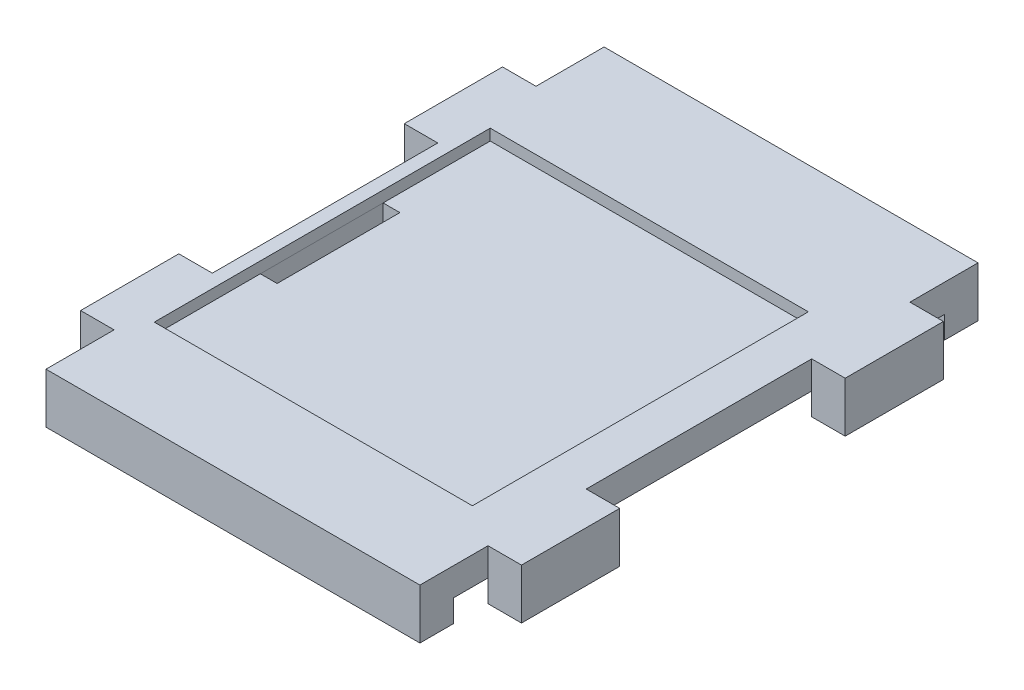
ISO-10303-21;
HEADER;
FILE_DESCRIPTION(('STEP AP214'),'2;1');
FILE_NAME('part.step','',(''),(''),'','','');
FILE_SCHEMA(('AUTOMOTIVE_DESIGN { 1 0 10303 214 1 1 1 1 }'));
ENDSEC;
DATA;
#1=APPLICATION_CONTEXT('core data for automotive mechanical design processes');
#2=APPLICATION_PROTOCOL_DEFINITION('international standard','automotive_design',2000,#1);
#3=PRODUCT_CONTEXT('',#1,'mechanical');
#4=PRODUCT('Part','Part','',(#3));
#5=PRODUCT_RELATED_PRODUCT_CATEGORY('part','',(#4));
#6=PRODUCT_DEFINITION_FORMATION('','',#4);
#7=PRODUCT_DEFINITION_CONTEXT('part definition',#1,'design');
#8=PRODUCT_DEFINITION('design','',#6,#7);
#9=PRODUCT_DEFINITION_SHAPE('','',#8);
#10=(LENGTH_UNIT() NAMED_UNIT(*) SI_UNIT(.MILLI.,.METRE.));
#11=(NAMED_UNIT(*) PLANE_ANGLE_UNIT() SI_UNIT($,.RADIAN.));
#12=(NAMED_UNIT(*) SI_UNIT($,.STERADIAN.) SOLID_ANGLE_UNIT());
#13=UNCERTAINTY_MEASURE_WITH_UNIT(LENGTH_MEASURE(1.E-05),#10,'distance_accuracy_value','');
#14=(GEOMETRIC_REPRESENTATION_CONTEXT(3) GLOBAL_UNCERTAINTY_ASSIGNED_CONTEXT((#13)) GLOBAL_UNIT_ASSIGNED_CONTEXT((#10,
#11,#12)) REPRESENTATION_CONTEXT('',''));
#15=CARTESIAN_POINT('',(0.,0.,0.));
#16=DIRECTION('',(0.,0.,1.));
#17=DIRECTION('',(1.,0.,0.));
#18=AXIS2_PLACEMENT_3D('',#15,#16,#17);
#19=CARTESIAN_POINT('',(0.,0.,0.));
#20=DIRECTION('',(0.,-1.,0.));
#21=DIRECTION('',(0.,0.,-1.));
#22=AXIS2_PLACEMENT_3D('',#19,#20,#21);
#23=PLANE('',#22);
#24=DIRECTION('',(0.,0.,-1.));
#25=VECTOR('',#24,1.);
#26=CARTESIAN_POINT('',(36.5,0.,-50.));
#27=LINE('',#26,#25);
#28=CARTESIAN_POINT('',(36.5,0.,-47.));
#29=VERTEX_POINT('',#28);
#30=CARTESIAN_POINT('',(36.5,0.,-50.));
#31=VERTEX_POINT('',#30);
#32=EDGE_CURVE('E290',#29,#31,#27,.T.);
#33=ORIENTED_EDGE('',*,*,#32,.F.);
#34=DIRECTION('',(-1.,0.,0.));
#35=VECTOR('',#34,1.);
#36=CARTESIAN_POINT('',(3.,0.,-47.));
#37=LINE('',#36,#35);
#38=CARTESIAN_POINT('',(3.,0.,-47.));
#39=VERTEX_POINT('',#38);
#40=EDGE_CURVE('E497',#29,#39,#37,.T.);
#41=ORIENTED_EDGE('',*,*,#40,.T.);
#42=DIRECTION('',(0.,0.,1.));
#43=VECTOR('',#42,1.);
#44=CARTESIAN_POINT('',(3.,0.,-50.));
#45=LINE('',#44,#43);
#46=CARTESIAN_POINT('',(3.,0.,-50.));
#47=VERTEX_POINT('',#46);
#48=EDGE_CURVE('E532',#47,#39,#45,.T.);
#49=ORIENTED_EDGE('',*,*,#48,.F.);
#50=DIRECTION('',(-1.,0.,0.));
#51=VECTOR('',#50,1.);
#52=CARTESIAN_POINT('',(0.,0.,-50.));
#53=LINE('',#52,#51);
#54=EDGE_CURVE('E47',#31,#47,#53,.T.);
#55=ORIENTED_EDGE('',*,*,#54,.F.);
#56=EDGE_LOOP('',(#33,#41,#49,#55));
#57=FACE_BOUND('',#56,.T.);
#58=ADVANCED_FACE('F38',(#57),#23,.T.);
#59=DIRECTION('',(-1.,0.,0.));
#60=VECTOR('',#59,1.);
#61=CARTESIAN_POINT('',(39.5,0.,-43.9));
#62=LINE('',#61,#60);
#63=CARTESIAN_POINT('',(39.5,0.,-43.9));
#64=VERTEX_POINT('',#63);
#65=CARTESIAN_POINT('',(36.5,0.,-43.9));
#66=VERTEX_POINT('',#65);
#67=EDGE_CURVE('E693',#64,#66,#62,.T.);
#68=ORIENTED_EDGE('',*,*,#67,.F.);
#69=DIRECTION('',(0.,0.,-1.));
#70=VECTOR('',#69,1.);
#71=CARTESIAN_POINT('',(39.5,0.,0.));
#72=LINE('',#71,#70);
#73=CARTESIAN_POINT('',(39.5,0.,-35.1));
#74=VERTEX_POINT('',#73);
#75=EDGE_CURVE('E299',#74,#64,#72,.T.);
#76=ORIENTED_EDGE('',*,*,#75,.F.);
#77=DIRECTION('',(1.,0.,0.));
#78=VECTOR('',#77,1.);
#79=CARTESIAN_POINT('',(39.5,0.,-35.1));
#80=LINE('',#79,#78);
#81=CARTESIAN_POINT('',(36.5,0.,-35.1));
#82=VERTEX_POINT('',#81);
#83=EDGE_CURVE('E678',#82,#74,#80,.T.);
#84=ORIENTED_EDGE('',*,*,#83,.F.);
#85=DIRECTION('',(0.,0.,-1.));
#86=VECTOR('',#85,1.);
#87=CARTESIAN_POINT('',(36.5,0.,-3.));
#88=LINE('',#87,#86);
#89=EDGE_CURVE('E493',#82,#66,#88,.T.);
#90=ORIENTED_EDGE('',*,*,#89,.T.);
#91=EDGE_LOOP('',(#68,#76,#84,#90));
#92=FACE_BOUND('',#91,.T.);
#93=ADVANCED_FACE('F705',(#92),#23,.T.);
#94=CARTESIAN_POINT('',(39.5,2.,0.));
#95=DIRECTION('',(-1.,0.,0.));
#96=DIRECTION('',(0.,0.,1.));
#97=AXIS2_PLACEMENT_3D('',#94,#95,#96);
#98=PLANE('',#97);
#99=ORIENTED_EDGE('',*,*,#75,.T.);
#100=DIRECTION('',(0.,-1.,0.));
#101=VECTOR('',#100,1.);
#102=CARTESIAN_POINT('',(39.5,4.5,-43.9));
#103=LINE('',#102,#101);
#104=CARTESIAN_POINT('',(39.5,4.5,-43.9));
#105=VERTEX_POINT('',#104);
#106=EDGE_CURVE('E285',#105,#64,#103,.T.);
#107=ORIENTED_EDGE('',*,*,#106,.F.);
#108=DIRECTION('',(0.,0.,-1.));
#109=VECTOR('',#108,1.);
#110=CARTESIAN_POINT('',(39.5,4.5,-50.));
#111=LINE('',#110,#109);
#112=CARTESIAN_POINT('',(39.5,4.5,-35.1));
#113=VERTEX_POINT('',#112);
#114=EDGE_CURVE('E297',#113,#105,#111,.T.);
#115=ORIENTED_EDGE('',*,*,#114,.F.);
#116=DIRECTION('',(0.,-1.,0.));
#117=VECTOR('',#116,1.);
#118=CARTESIAN_POINT('',(39.5,4.5,-35.1));
#119=LINE('',#118,#117);
#120=EDGE_CURVE('E665',#113,#74,#119,.T.);
#121=ORIENTED_EDGE('',*,*,#120,.T.);
#122=EDGE_LOOP('',(#99,#107,#115,#121));
#123=FACE_BOUND('',#122,.T.);
#124=ADVANCED_FACE('F295',(#123),#98,.F.);
#125=CARTESIAN_POINT('',(36.5,2.,-3.));
#126=DIRECTION('',(-1.,0.,0.));
#127=DIRECTION('',(0.,0.,1.));
#128=AXIS2_PLACEMENT_3D('',#125,#126,#127);
#129=PLANE('',#128);
#130=DIRECTION('',(0.,-1.,0.));
#131=VECTOR('',#130,1.);
#132=CARTESIAN_POINT('',(36.5,4.5,-43.9));
#133=LINE('',#132,#131);
#134=CARTESIAN_POINT('',(36.5,2.,-43.9));
#135=VERTEX_POINT('',#134);
#136=EDGE_CURVE('E300',#135,#66,#133,.T.);
#137=ORIENTED_EDGE('',*,*,#136,.T.);
#138=ORIENTED_EDGE('',*,*,#89,.F.);
#139=DIRECTION('',(0.,-1.,0.));
#140=VECTOR('',#139,1.);
#141=CARTESIAN_POINT('',(36.5,4.5,-35.1));
#142=LINE('',#141,#140);
#143=CARTESIAN_POINT('',(36.5,2.,-35.1));
#144=VERTEX_POINT('',#143);
#145=EDGE_CURVE('E671',#144,#82,#142,.T.);
#146=ORIENTED_EDGE('',*,*,#145,.F.);
#147=DIRECTION('',(0.,0.,-1.));
#148=VECTOR('',#147,1.);
#149=CARTESIAN_POINT('',(36.5,2.,-3.));
#150=LINE('',#149,#148);
#151=EDGE_CURVE('E479',#144,#135,#150,.T.);
#152=ORIENTED_EDGE('',*,*,#151,.T.);
#153=EDGE_LOOP('',(#137,#138,#146,#152));
#154=FACE_BOUND('',#153,.T.);
#155=ADVANCED_FACE('F701',(#154),#129,.T.);
#156=DIRECTION('',(-1.,0.,0.));
#157=VECTOR('',#156,1.);
#158=CARTESIAN_POINT('',(39.5,0.,-14.9));
#159=LINE('',#158,#157);
#160=CARTESIAN_POINT('',(39.5,0.,-14.9));
#161=VERTEX_POINT('',#160);
#162=CARTESIAN_POINT('',(36.5,0.,-14.9));
#163=VERTEX_POINT('',#162);
#164=EDGE_CURVE('E682',#161,#163,#159,.T.);
#165=ORIENTED_EDGE('',*,*,#164,.F.);
#166=CARTESIAN_POINT('',(39.5,0.,-6.1));
#167=VERTEX_POINT('',#166);
#168=EDGE_CURVE('E515',#167,#161,#72,.T.);
#169=ORIENTED_EDGE('',*,*,#168,.F.);
#170=DIRECTION('',(1.,0.,0.));
#171=VECTOR('',#170,1.);
#172=CARTESIAN_POINT('',(39.5,0.,-6.1));
#173=LINE('',#172,#171);
#174=CARTESIAN_POINT('',(36.5,0.,-6.1));
#175=VERTEX_POINT('',#174);
#176=EDGE_CURVE('E650',#175,#167,#173,.T.);
#177=ORIENTED_EDGE('',*,*,#176,.F.);
#178=EDGE_CURVE('E494',#175,#163,#88,.T.);
#179=ORIENTED_EDGE('',*,*,#178,.T.);
#180=EDGE_LOOP('',(#165,#169,#177,#179));
#181=FACE_BOUND('',#180,.T.);
#182=ADVANCED_FACE('F749',(#181),#23,.T.);
#183=DIRECTION('',(-1.,0.,0.));
#184=VECTOR('',#183,1.);
#185=CARTESIAN_POINT('',(0.,0.,-43.9));
#186=LINE('',#185,#184);
#187=CARTESIAN_POINT('',(3.,0.,-43.9));
#188=VERTEX_POINT('',#187);
#189=CARTESIAN_POINT('',(0.,0.,-43.9));
#190=VERTEX_POINT('',#189);
#191=EDGE_CURVE('E541',#188,#190,#186,.T.);
#192=ORIENTED_EDGE('',*,*,#191,.F.);
#193=DIRECTION('',(0.,0.,1.));
#194=VECTOR('',#193,1.);
#195=CARTESIAN_POINT('',(3.,0.,-3.));
#196=LINE('',#195,#194);
#197=CARTESIAN_POINT('',(3.,0.,-35.1));
#198=VERTEX_POINT('',#197);
#199=EDGE_CURVE('E488',#188,#198,#196,.T.);
#200=ORIENTED_EDGE('',*,*,#199,.T.);
#201=DIRECTION('',(1.,0.,0.));
#202=VECTOR('',#201,1.);
#203=CARTESIAN_POINT('',(0.,0.,-35.1));
#204=LINE('',#203,#202);
#205=CARTESIAN_POINT('',(0.,0.,-35.1));
#206=VERTEX_POINT('',#205);
#207=EDGE_CURVE('E555',#206,#198,#204,.T.);
#208=ORIENTED_EDGE('',*,*,#207,.F.);
#209=DIRECTION('',(0.,0.,1.));
#210=VECTOR('',#209,1.);
#211=CARTESIAN_POINT('',(0.,0.,0.));
#212=LINE('',#211,#210);
#213=EDGE_CURVE('E510',#190,#206,#212,.T.);
#214=ORIENTED_EDGE('',*,*,#213,.F.);
#215=EDGE_LOOP('',(#192,#200,#208,#214));
#216=FACE_BOUND('',#215,.T.);
#217=ADVANCED_FACE('F638',(#216),#23,.T.);
#218=DIRECTION('',(-1.,0.,0.));
#219=VECTOR('',#218,1.);
#220=CARTESIAN_POINT('',(0.,0.,-14.9));
#221=LINE('',#220,#219);
#222=CARTESIAN_POINT('',(3.,0.,-14.9));
#223=VERTEX_POINT('',#222);
#224=CARTESIAN_POINT('',(0.,0.,-14.9));
#225=VERTEX_POINT('',#224);
#226=EDGE_CURVE('E562',#223,#225,#221,.T.);
#227=ORIENTED_EDGE('',*,*,#226,.F.);
#228=CARTESIAN_POINT('',(3.,0.,-6.1));
#229=VERTEX_POINT('',#228);
#230=EDGE_CURVE('E470',#223,#229,#196,.T.);
#231=ORIENTED_EDGE('',*,*,#230,.T.);
#232=DIRECTION('',(1.,0.,0.));
#233=VECTOR('',#232,1.);
#234=CARTESIAN_POINT('',(0.,0.,-6.1));
#235=LINE('',#234,#233);
#236=CARTESIAN_POINT('',(0.,0.,-6.1));
#237=VERTEX_POINT('',#236);
#238=EDGE_CURVE('E586',#237,#229,#235,.T.);
#239=ORIENTED_EDGE('',*,*,#238,.F.);
#240=EDGE_CURVE('E509',#225,#237,#212,.T.);
#241=ORIENTED_EDGE('',*,*,#240,.F.);
#242=EDGE_LOOP('',(#227,#231,#239,#241));
#243=FACE_BOUND('',#242,.T.);
#244=ADVANCED_FACE('F610',(#243),#23,.T.);
#245=CARTESIAN_POINT('',(0.,2.,0.));
#246=DIRECTION('',(1.,0.,0.));
#247=DIRECTION('',(0.,0.,-1.));
#248=AXIS2_PLACEMENT_3D('',#245,#246,#247);
#249=PLANE('',#248);
#250=DIRECTION('',(0.,0.,1.));
#251=VECTOR('',#250,1.);
#252=CARTESIAN_POINT('',(0.,4.5,-50.));
#253=LINE('',#252,#251);
#254=CARTESIAN_POINT('',(0.,4.5,-14.9));
#255=VERTEX_POINT('',#254);
#256=CARTESIAN_POINT('',(0.,4.5,-6.1));
#257=VERTEX_POINT('',#256);
#258=EDGE_CURVE('E445',#255,#257,#253,.T.);
#259=ORIENTED_EDGE('',*,*,#258,.F.);
#260=DIRECTION('',(0.,-1.,0.));
#261=VECTOR('',#260,1.);
#262=CARTESIAN_POINT('',(0.,4.5,-14.9));
#263=LINE('',#262,#261);
#264=EDGE_CURVE('E571',#255,#225,#263,.T.);
#265=ORIENTED_EDGE('',*,*,#264,.T.);
#266=ORIENTED_EDGE('',*,*,#240,.T.);
#267=DIRECTION('',(0.,-1.,0.));
#268=VECTOR('',#267,1.);
#269=CARTESIAN_POINT('',(0.,4.5,-6.1));
#270=LINE('',#269,#268);
#271=EDGE_CURVE('E423',#257,#237,#270,.T.);
#272=ORIENTED_EDGE('',*,*,#271,.F.);
#273=EDGE_LOOP('',(#259,#265,#266,#272));
#274=FACE_BOUND('',#273,.T.);
#275=ADVANCED_FACE('F759',(#274),#249,.F.);
#276=CARTESIAN_POINT('',(3.,2.,-3.));
#277=DIRECTION('',(1.,0.,0.));
#278=DIRECTION('',(0.,0.,-1.));
#279=AXIS2_PLACEMENT_3D('',#276,#277,#278);
#280=PLANE('',#279);
#281=DIRECTION('',(0.,-1.,0.));
#282=VECTOR('',#281,1.);
#283=CARTESIAN_POINT('',(3.,4.5,-14.9));
#284=LINE('',#283,#282);
#285=CARTESIAN_POINT('',(3.,2.,-14.9));
#286=VERTEX_POINT('',#285);
#287=EDGE_CURVE('E578',#286,#223,#284,.T.);
#288=ORIENTED_EDGE('',*,*,#287,.F.);
#289=DIRECTION('',(0.,0.,1.));
#290=VECTOR('',#289,1.);
#291=CARTESIAN_POINT('',(3.,2.,-3.));
#292=LINE('',#291,#290);
#293=CARTESIAN_POINT('',(3.,2.,-6.1));
#294=VERTEX_POINT('',#293);
#295=EDGE_CURVE('E475',#286,#294,#292,.T.);
#296=ORIENTED_EDGE('',*,*,#295,.T.);
#297=DIRECTION('',(0.,-1.,0.));
#298=VECTOR('',#297,1.);
#299=CARTESIAN_POINT('',(3.,4.5,-6.1));
#300=LINE('',#299,#298);
#301=EDGE_CURVE('E595',#294,#229,#300,.T.);
#302=ORIENTED_EDGE('',*,*,#301,.T.);
#303=ORIENTED_EDGE('',*,*,#230,.F.);
#304=EDGE_LOOP('',(#288,#296,#302,#303));
#305=FACE_BOUND('',#304,.T.);
#306=ADVANCED_FACE('F612',(#305),#280,.T.);
#307=DIRECTION('',(0.,0.,-1.));
#308=VECTOR('',#307,1.);
#309=CARTESIAN_POINT('',(36.5,0.,0.));
#310=LINE('',#309,#308);
#311=CARTESIAN_POINT('',(36.5,0.,0.));
#312=VERTEX_POINT('',#311);
#313=CARTESIAN_POINT('',(36.5,0.,-3.));
#314=VERTEX_POINT('',#313);
#315=EDGE_CURVE('E654',#312,#314,#310,.T.);
#316=ORIENTED_EDGE('',*,*,#315,.F.);
#317=DIRECTION('',(1.,0.,0.));
#318=VECTOR('',#317,1.);
#319=CARTESIAN_POINT('',(0.,0.,0.));
#320=LINE('',#319,#318);
#321=CARTESIAN_POINT('',(3.,0.,0.));
#322=VERTEX_POINT('',#321);
#323=EDGE_CURVE('E512',#322,#312,#320,.T.);
#324=ORIENTED_EDGE('',*,*,#323,.F.);
#325=DIRECTION('',(0.,0.,1.));
#326=VECTOR('',#325,1.);
#327=CARTESIAN_POINT('',(3.,0.,0.));
#328=LINE('',#327,#326);
#329=CARTESIAN_POINT('',(3.,0.,-3.));
#330=VERTEX_POINT('',#329);
#331=EDGE_CURVE('E590',#330,#322,#328,.T.);
#332=ORIENTED_EDGE('',*,*,#331,.F.);
#333=DIRECTION('',(1.,0.,0.));
#334=VECTOR('',#333,1.);
#335=CARTESIAN_POINT('',(3.,0.,-3.));
#336=LINE('',#335,#334);
#337=EDGE_CURVE('E490',#330,#314,#336,.T.);
#338=ORIENTED_EDGE('',*,*,#337,.T.);
#339=EDGE_LOOP('',(#316,#324,#332,#338));
#340=FACE_BOUND('',#339,.T.);
#341=ADVANCED_FACE('F745',(#340),#23,.T.);
#342=CARTESIAN_POINT('',(0.,4.5,-43.9));
#343=VERTEX_POINT('',#342);
#344=CARTESIAN_POINT('',(0.,4.5,-35.1));
#345=VERTEX_POINT('',#344);
#346=EDGE_CURVE('E315',#343,#345,#253,.T.);
#347=ORIENTED_EDGE('',*,*,#346,.F.);
#348=DIRECTION('',(0.,-1.,0.));
#349=VECTOR('',#348,1.);
#350=CARTESIAN_POINT('',(0.,4.5,-43.9));
#351=LINE('',#350,#349);
#352=EDGE_CURVE('E552',#343,#190,#351,.T.);
#353=ORIENTED_EDGE('',*,*,#352,.T.);
#354=ORIENTED_EDGE('',*,*,#213,.T.);
#355=DIRECTION('',(0.,-1.,0.));
#356=VECTOR('',#355,1.);
#357=CARTESIAN_POINT('',(0.,4.5,-35.1));
#358=LINE('',#357,#356);
#359=EDGE_CURVE('E567',#345,#206,#358,.T.);
#360=ORIENTED_EDGE('',*,*,#359,.F.);
#361=EDGE_LOOP('',(#347,#353,#354,#360));
#362=FACE_BOUND('',#361,.T.);
#363=ADVANCED_FACE('F40',(#362),#249,.F.);
#364=CARTESIAN_POINT('',(0.,2.,0.));
#365=DIRECTION('',(0.,0.,-1.));
#366=DIRECTION('',(-1.,0.,0.));
#367=AXIS2_PLACEMENT_3D('',#364,#365,#366);
#368=PLANE('',#367);
#369=ORIENTED_EDGE('',*,*,#323,.T.);
#370=DIRECTION('',(0.,-1.,0.));
#371=VECTOR('',#370,1.);
#372=CARTESIAN_POINT('',(36.5,4.5,0.));
#373=LINE('',#372,#371);
#374=CARTESIAN_POINT('',(36.5,4.5,0.));
#375=VERTEX_POINT('',#374);
#376=EDGE_CURVE('E643',#375,#312,#373,.T.);
#377=ORIENTED_EDGE('',*,*,#376,.F.);
#378=DIRECTION('',(1.,0.,0.));
#379=VECTOR('',#378,1.);
#380=CARTESIAN_POINT('',(0.,4.5,0.));
#381=LINE('',#380,#379);
#382=CARTESIAN_POINT('',(3.,4.5,0.));
#383=VERTEX_POINT('',#382);
#384=EDGE_CURVE('E308',#383,#375,#381,.T.);
#385=ORIENTED_EDGE('',*,*,#384,.F.);
#386=DIRECTION('',(0.,-1.,0.));
#387=VECTOR('',#386,1.);
#388=CARTESIAN_POINT('',(3.,4.5,0.));
#389=LINE('',#388,#387);
#390=EDGE_CURVE('E412',#383,#322,#389,.T.);
#391=ORIENTED_EDGE('',*,*,#390,.T.);
#392=EDGE_LOOP('',(#369,#377,#385,#391));
#393=FACE_BOUND('',#392,.T.);
#394=ADVANCED_FACE('F758',(#393),#368,.F.);
#395=ORIENTED_EDGE('',*,*,#168,.T.);
#396=DIRECTION('',(0.,-1.,0.));
#397=VECTOR('',#396,1.);
#398=CARTESIAN_POINT('',(39.5,4.5,-14.9));
#399=LINE('',#398,#397);
#400=CARTESIAN_POINT('',(39.5,4.5,-14.9));
#401=VERTEX_POINT('',#400);
#402=EDGE_CURVE('E666',#401,#161,#399,.T.);
#403=ORIENTED_EDGE('',*,*,#402,.F.);
#404=CARTESIAN_POINT('',(39.5,4.5,-6.1));
#405=VERTEX_POINT('',#404);
#406=EDGE_CURVE('E307',#405,#401,#111,.T.);
#407=ORIENTED_EDGE('',*,*,#406,.F.);
#408=DIRECTION('',(0.,-1.,0.));
#409=VECTOR('',#408,1.);
#410=CARTESIAN_POINT('',(39.5,4.5,-6.1));
#411=LINE('',#410,#409);
#412=EDGE_CURVE('E542',#405,#167,#411,.T.);
#413=ORIENTED_EDGE('',*,*,#412,.T.);
#414=EDGE_LOOP('',(#395,#403,#407,#413));
#415=FACE_BOUND('',#414,.T.);
#416=ADVANCED_FACE('F782',(#415),#98,.F.);
#417=CARTESIAN_POINT('',(0.,2.,-50.));
#418=DIRECTION('',(0.,0.,1.));
#419=DIRECTION('',(1.,0.,0.));
#420=AXIS2_PLACEMENT_3D('',#417,#418,#419);
#421=PLANE('',#420);
#422=DIRECTION('',(-1.,0.,0.));
#423=VECTOR('',#422,1.);
#424=CARTESIAN_POINT('',(0.,4.5,-50.));
#425=LINE('',#424,#423);
#426=CARTESIAN_POINT('',(36.5,4.5,-50.));
#427=VERTEX_POINT('',#426);
#428=CARTESIAN_POINT('',(3.,4.5,-50.));
#429=VERTEX_POINT('',#428);
#430=EDGE_CURVE('E312',#427,#429,#425,.T.);
#431=ORIENTED_EDGE('',*,*,#430,.F.);
#432=DIRECTION('',(0.,-1.,0.));
#433=VECTOR('',#432,1.);
#434=CARTESIAN_POINT('',(36.5,4.5,-50.));
#435=LINE('',#434,#433);
#436=EDGE_CURVE('E525',#427,#31,#435,.T.);
#437=ORIENTED_EDGE('',*,*,#436,.T.);
#438=ORIENTED_EDGE('',*,*,#54,.T.);
#439=DIRECTION('',(0.,-1.,0.));
#440=VECTOR('',#439,1.);
#441=CARTESIAN_POINT('',(3.,4.5,-50.));
#442=LINE('',#441,#440);
#443=EDGE_CURVE('E524',#429,#47,#442,.T.);
#444=ORIENTED_EDGE('',*,*,#443,.F.);
#445=EDGE_LOOP('',(#431,#437,#438,#444));
#446=FACE_BOUND('',#445,.T.);
#447=ADVANCED_FACE('F523',(#446),#421,.F.);
#448=DIRECTION('',(0.,-1.,0.));
#449=VECTOR('',#448,1.);
#450=CARTESIAN_POINT('',(3.,4.5,-43.9));
#451=LINE('',#450,#449);
#452=CARTESIAN_POINT('',(3.,2.,-43.9));
#453=VERTEX_POINT('',#452);
#454=EDGE_CURVE('E537',#453,#188,#451,.T.);
#455=ORIENTED_EDGE('',*,*,#454,.F.);
#456=CARTESIAN_POINT('',(3.,2.,-35.1));
#457=VERTEX_POINT('',#456);
#458=EDGE_CURVE('E474',#453,#457,#292,.T.);
#459=ORIENTED_EDGE('',*,*,#458,.T.);
#460=DIRECTION('',(0.,-1.,0.));
#461=VECTOR('',#460,1.);
#462=CARTESIAN_POINT('',(3.,4.5,-35.1));
#463=LINE('',#462,#461);
#464=EDGE_CURVE('E582',#457,#198,#463,.T.);
#465=ORIENTED_EDGE('',*,*,#464,.T.);
#466=ORIENTED_EDGE('',*,*,#199,.F.);
#467=EDGE_LOOP('',(#455,#459,#465,#466));
#468=FACE_BOUND('',#467,.T.);
#469=ADVANCED_FACE('F623',(#468),#280,.T.);
#470=CARTESIAN_POINT('',(3.,2.,-3.));
#471=DIRECTION('',(0.,0.,-1.));
#472=DIRECTION('',(-1.,0.,0.));
#473=AXIS2_PLACEMENT_3D('',#470,#471,#472);
#474=PLANE('',#473);
#475=ORIENTED_EDGE('',*,*,#337,.F.);
#476=DIRECTION('',(0.,-1.,0.));
#477=VECTOR('',#476,1.);
#478=CARTESIAN_POINT('',(3.,2.,-3.));
#479=LINE('',#478,#477);
#480=CARTESIAN_POINT('',(3.,2.,-3.));
#481=VERTEX_POINT('',#480);
#482=EDGE_CURVE('E507',#481,#330,#479,.T.);
#483=ORIENTED_EDGE('',*,*,#482,.F.);
#484=DIRECTION('',(1.,0.,0.));
#485=VECTOR('',#484,1.);
#486=CARTESIAN_POINT('',(3.,2.,-3.));
#487=LINE('',#486,#485);
#488=CARTESIAN_POINT('',(36.5,2.,-3.));
#489=VERTEX_POINT('',#488);
#490=EDGE_CURVE('E473',#481,#489,#487,.T.);
#491=ORIENTED_EDGE('',*,*,#490,.T.);
#492=DIRECTION('',(0.,-1.,0.));
#493=VECTOR('',#492,1.);
#494=CARTESIAN_POINT('',(36.5,2.,-3.));
#495=LINE('',#494,#493);
#496=EDGE_CURVE('E504',#489,#314,#495,.T.);
#497=ORIENTED_EDGE('',*,*,#496,.T.);
#498=EDGE_LOOP('',(#475,#483,#491,#497));
#499=FACE_BOUND('',#498,.T.);
#500=ADVANCED_FACE('F797',(#499),#474,.T.);
#501=DIRECTION('',(0.,-1.,0.));
#502=VECTOR('',#501,1.);
#503=CARTESIAN_POINT('',(36.5,4.5,-14.9));
#504=LINE('',#503,#502);
#505=CARTESIAN_POINT('',(36.5,2.,-14.9));
#506=VERTEX_POINT('',#505);
#507=EDGE_CURVE('E668',#506,#163,#504,.T.);
#508=ORIENTED_EDGE('',*,*,#507,.T.);
#509=ORIENTED_EDGE('',*,*,#178,.F.);
#510=DIRECTION('',(0.,-1.,0.));
#511=VECTOR('',#510,1.);
#512=CARTESIAN_POINT('',(36.5,4.5,-6.1));
#513=LINE('',#512,#511);
#514=CARTESIAN_POINT('',(36.5,2.,-6.1));
#515=VERTEX_POINT('',#514);
#516=EDGE_CURVE('E645',#515,#175,#513,.T.);
#517=ORIENTED_EDGE('',*,*,#516,.F.);
#518=EDGE_CURVE('E484',#515,#506,#150,.T.);
#519=ORIENTED_EDGE('',*,*,#518,.T.);
#520=EDGE_LOOP('',(#508,#509,#517,#519));
#521=FACE_BOUND('',#520,.T.);
#522=ADVANCED_FACE('F740',(#521),#129,.T.);
#523=CARTESIAN_POINT('',(3.,2.,-47.));
#524=DIRECTION('',(0.,0.,1.));
#525=DIRECTION('',(1.,0.,0.));
#526=AXIS2_PLACEMENT_3D('',#523,#524,#525);
#527=PLANE('',#526);
#528=ORIENTED_EDGE('',*,*,#40,.F.);
#529=DIRECTION('',(0.,-1.,0.));
#530=VECTOR('',#529,1.);
#531=CARTESIAN_POINT('',(36.5,2.,-47.));
#532=LINE('',#531,#530);
#533=CARTESIAN_POINT('',(36.5,2.,-47.));
#534=VERTEX_POINT('',#533);
#535=EDGE_CURVE('E502',#534,#29,#532,.T.);
#536=ORIENTED_EDGE('',*,*,#535,.F.);
#537=DIRECTION('',(-1.,0.,0.));
#538=VECTOR('',#537,1.);
#539=CARTESIAN_POINT('',(3.,2.,-47.));
#540=LINE('',#539,#538);
#541=CARTESIAN_POINT('',(3.,2.,-47.));
#542=VERTEX_POINT('',#541);
#543=EDGE_CURVE('E483',#534,#542,#540,.T.);
#544=ORIENTED_EDGE('',*,*,#543,.T.);
#545=DIRECTION('',(0.,-1.,0.));
#546=VECTOR('',#545,1.);
#547=CARTESIAN_POINT('',(3.,2.,-47.));
#548=LINE('',#547,#546);
#549=EDGE_CURVE('E487',#542,#39,#548,.T.);
#550=ORIENTED_EDGE('',*,*,#549,.T.);
#551=EDGE_LOOP('',(#528,#536,#544,#550));
#552=FACE_BOUND('',#551,.T.);
#553=ADVANCED_FACE('F735',(#552),#527,.T.);
#554=CARTESIAN_POINT('',(0.,2.,0.));
#555=DIRECTION('',(0.,-1.,0.));
#556=DIRECTION('',(0.,0.,-1.));
#557=AXIS2_PLACEMENT_3D('',#554,#555,#556);
#558=PLANE('',#557);
#559=DIRECTION('',(0.,0.,-1.));
#560=VECTOR('',#559,1.);
#561=CARTESIAN_POINT('',(4.2060231356666,2.,0.));
#562=LINE('',#561,#560);
#563=CARTESIAN_POINT('',(4.20602313566659,2.,-18.));
#564=VERTEX_POINT('',#563);
#565=CARTESIAN_POINT('',(4.20602313566659,2.,-29.));
#566=VERTEX_POINT('',#565);
#567=EDGE_CURVE('E468',#564,#566,#562,.T.);
#568=ORIENTED_EDGE('',*,*,#567,.F.);
#569=DIRECTION('',(-1.,0.,0.));
#570=VECTOR('',#569,1.);
#571=CARTESIAN_POINT('',(0.,2.,-18.));
#572=LINE('',#571,#570);
#573=CARTESIAN_POINT('',(5.70602313566659,2.,-18.));
#574=VERTEX_POINT('',#573);
#575=EDGE_CURVE('E378',#574,#564,#572,.T.);
#576=ORIENTED_EDGE('',*,*,#575,.F.);
#577=DIRECTION('',(0.,0.,1.));
#578=VECTOR('',#577,1.);
#579=CARTESIAN_POINT('',(5.7060231356666,2.,0.));
#580=LINE('',#579,#578);
#581=CARTESIAN_POINT('',(5.70602313566659,2.,-29.));
#582=VERTEX_POINT('',#581);
#583=EDGE_CURVE('E463',#582,#574,#580,.T.);
#584=ORIENTED_EDGE('',*,*,#583,.F.);
#585=DIRECTION('',(1.,0.,0.));
#586=VECTOR('',#585,1.);
#587=CARTESIAN_POINT('',(0.,2.,-29.));
#588=LINE('',#587,#586);
#589=EDGE_CURVE('E466',#566,#582,#588,.T.);
#590=ORIENTED_EDGE('',*,*,#589,.F.);
#591=EDGE_LOOP('',(#568,#576,#584,#590));
#592=FACE_BOUND('',#591,.T.);
#593=ORIENTED_EDGE('',*,*,#490,.F.);
#594=DIRECTION('',(0.,0.,1.));
#595=VECTOR('',#594,1.);
#596=CARTESIAN_POINT('',(3.,2.,0.));
#597=LINE('',#596,#595);
#598=EDGE_CURVE('E403',#294,#481,#597,.T.);
#599=ORIENTED_EDGE('',*,*,#598,.F.);
#600=ORIENTED_EDGE('',*,*,#295,.F.);
#601=DIRECTION('',(0.,0.,1.));
#602=VECTOR('',#601,1.);
#603=CARTESIAN_POINT('',(3.,2.,0.));
#604=LINE('',#603,#602);
#605=EDGE_CURVE('E574',#457,#286,#604,.T.);
#606=ORIENTED_EDGE('',*,*,#605,.F.);
#607=ORIENTED_EDGE('',*,*,#458,.F.);
#608=EDGE_CURVE('E471',#542,#453,#292,.T.);
#609=ORIENTED_EDGE('',*,*,#608,.F.);
#610=ORIENTED_EDGE('',*,*,#543,.F.);
#611=DIRECTION('',(0.,0.,-1.));
#612=VECTOR('',#611,1.);
#613=CARTESIAN_POINT('',(36.5,2.,0.));
#614=LINE('',#613,#612);
#615=EDGE_CURVE('E684',#135,#534,#614,.T.);
#616=ORIENTED_EDGE('',*,*,#615,.F.);
#617=ORIENTED_EDGE('',*,*,#151,.F.);
#618=DIRECTION('',(0.,0.,-1.));
#619=VECTOR('',#618,1.);
#620=CARTESIAN_POINT('',(36.5,2.,0.));
#621=LINE('',#620,#619);
#622=EDGE_CURVE('E656',#506,#144,#621,.T.);
#623=ORIENTED_EDGE('',*,*,#622,.F.);
#624=ORIENTED_EDGE('',*,*,#518,.F.);
#625=EDGE_CURVE('E480',#489,#515,#150,.T.);
#626=ORIENTED_EDGE('',*,*,#625,.F.);
#627=EDGE_LOOP('',(#593,#599,#600,#606,#607,#609,#610,#616,#617,#623,#624,#626));
#628=FACE_BOUND('',#627,.T.);
#629=ADVANCED_FACE('F617',(#592,#628),#558,.T.);
#630=CARTESIAN_POINT('',(0.,3.5,0.));
#631=DIRECTION('',(0.,-1.,0.));
#632=DIRECTION('',(0.,0.,-1.));
#633=AXIS2_PLACEMENT_3D('',#630,#631,#632);
#634=PLANE('',#633);
#635=DIRECTION('',(-1.,0.,0.));
#636=VECTOR('',#635,1.);
#637=CARTESIAN_POINT('',(4.2,3.5,-38.6));
#638=LINE('',#637,#636);
#639=CARTESIAN_POINT('',(32.7,3.5,-38.6));
#640=VERTEX_POINT('',#639);
#641=CARTESIAN_POINT('',(4.2,3.5,-38.6));
#642=VERTEX_POINT('',#641);
#643=EDGE_CURVE('E428',#640,#642,#638,.T.);
#644=ORIENTED_EDGE('',*,*,#643,.T.);
#645=DIRECTION('',(0.,0.,-1.));
#646=VECTOR('',#645,1.);
#647=CARTESIAN_POINT('',(4.2,3.5,0.));
#648=LINE('',#647,#646);
#649=CARTESIAN_POINT('',(4.2030115678333,3.5,-29.));
#650=VERTEX_POINT('',#649);
#651=EDGE_CURVE('E400',#642,#650,#648,.F.);
#652=ORIENTED_EDGE('',*,*,#651,.T.);
#653=DIRECTION('',(-1.,0.,0.));
#654=VECTOR('',#653,1.);
#655=CARTESIAN_POINT('',(4.20602313566659,3.5,-29.));
#656=LINE('',#655,#654);
#657=CARTESIAN_POINT('',(5.70602313566659,3.5,-29.));
#658=VERTEX_POINT('',#657);
#659=EDGE_CURVE('E382',#658,#650,#656,.T.);
#660=ORIENTED_EDGE('',*,*,#659,.F.);
#661=DIRECTION('',(0.,0.,-1.));
#662=VECTOR('',#661,1.);
#663=CARTESIAN_POINT('',(5.70602313566659,3.5,-29.));
#664=LINE('',#663,#662);
#665=CARTESIAN_POINT('',(5.70602313566659,3.5,-18.));
#666=VERTEX_POINT('',#665);
#667=EDGE_CURVE('E386',#666,#658,#664,.T.);
#668=ORIENTED_EDGE('',*,*,#667,.F.);
#669=DIRECTION('',(1.,0.,0.));
#670=VECTOR('',#669,1.);
#671=CARTESIAN_POINT('',(4.20602313566659,3.5,-18.));
#672=LINE('',#671,#670);
#673=CARTESIAN_POINT('',(4.2030115678333,3.5,-18.));
#674=VERTEX_POINT('',#673);
#675=EDGE_CURVE('E394',#674,#666,#672,.T.);
#676=ORIENTED_EDGE('',*,*,#675,.F.);
#677=DIRECTION('',(0.,0.,-1.));
#678=VECTOR('',#677,1.);
#679=CARTESIAN_POINT('',(4.2,3.5,0.));
#680=LINE('',#679,#678);
#681=CARTESIAN_POINT('',(4.2,3.5,-8.5));
#682=VERTEX_POINT('',#681);
#683=EDGE_CURVE('E11',#674,#682,#680,.F.);
#684=ORIENTED_EDGE('',*,*,#683,.T.);
#685=DIRECTION('',(1.,0.,0.));
#686=VECTOR('',#685,1.);
#687=CARTESIAN_POINT('',(4.20000000000001,3.5,-8.5));
#688=LINE('',#687,#686);
#689=CARTESIAN_POINT('',(32.7,3.5,-8.5));
#690=VERTEX_POINT('',#689);
#691=EDGE_CURVE('E402',#682,#690,#688,.T.);
#692=ORIENTED_EDGE('',*,*,#691,.T.);
#693=DIRECTION('',(0.,0.,-1.));
#694=VECTOR('',#693,1.);
#695=CARTESIAN_POINT('',(32.7,3.5,-38.6));
#696=LINE('',#695,#694);
#697=EDGE_CURVE('E410',#690,#640,#696,.T.);
#698=ORIENTED_EDGE('',*,*,#697,.T.);
#699=EDGE_LOOP('',(#644,#652,#660,#668,#676,#684,#692,#698));
#700=FACE_BOUND('',#699,.T.);
#701=ADVANCED_FACE('F360',(#700),#634,.F.);
#702=CARTESIAN_POINT('',(4.20602313566659,0.5,-29.));
#703=DIRECTION('',(-1.,0.,0.));
#704=DIRECTION('',(0.,0.,1.));
#705=AXIS2_PLACEMENT_3D('',#702,#703,#704);
#706=PLANE('',#705);
#707=ORIENTED_EDGE('',*,*,#567,.T.);
#708=DIRECTION('',(0.,1.,0.));
#709=VECTOR('',#708,1.);
#710=CARTESIAN_POINT('',(4.20602313566659,0.5,-29.));
#711=LINE('',#710,#709);
#712=EDGE_CURVE('E370',#566,#650,#711,.T.);
#713=ORIENTED_EDGE('',*,*,#712,.T.);
#714=CARTESIAN_POINT('',(4.20602313566659,3.5,-29.));
#715=DIRECTION('',(0.,0.,1.));
#716=VECTOR('',#715,1.);
#717=LINE('',#714,#716);
#718=EDGE_CURVE('E321',#650,#674,#717,.T.);
#719=ORIENTED_EDGE('',*,*,#718,.T.);
#720=DIRECTION('',(0.,1.,0.));
#721=VECTOR('',#720,1.);
#722=CARTESIAN_POINT('',(4.20602313566659,0.5,-18.));
#723=LINE('',#722,#721);
#724=EDGE_CURVE('E385',#564,#674,#723,.T.);
#725=ORIENTED_EDGE('',*,*,#724,.F.);
#726=EDGE_LOOP('',(#707,#713,#719,#725));
#727=FACE_BOUND('',#726,.T.);
#728=ADVANCED_FACE('F349',(#727),#706,.F.);
#729=CARTESIAN_POINT('',(4.20602313566659,0.5,-29.));
#730=DIRECTION('',(0.,0.,-1.));
#731=DIRECTION('',(-1.,0.,0.));
#732=AXIS2_PLACEMENT_3D('',#729,#730,#731);
#733=PLANE('',#732);
#734=ORIENTED_EDGE('',*,*,#589,.T.);
#735=DIRECTION('',(0.,1.,0.));
#736=VECTOR('',#735,1.);
#737=CARTESIAN_POINT('',(5.70602313566659,0.5,-29.));
#738=LINE('',#737,#736);
#739=EDGE_CURVE('E379',#582,#658,#738,.T.);
#740=ORIENTED_EDGE('',*,*,#739,.T.);
#741=ORIENTED_EDGE('',*,*,#659,.T.);
#742=ORIENTED_EDGE('',*,*,#712,.F.);
#743=EDGE_LOOP('',(#734,#740,#741,#742));
#744=FACE_BOUND('',#743,.T.);
#745=ADVANCED_FACE('F345',(#744),#733,.F.);
#746=CARTESIAN_POINT('',(5.70602313566659,0.5,-29.));
#747=DIRECTION('',(1.,0.,0.));
#748=DIRECTION('',(0.,0.,-1.));
#749=AXIS2_PLACEMENT_3D('',#746,#747,#748);
#750=PLANE('',#749);
#751=ORIENTED_EDGE('',*,*,#583,.T.);
#752=DIRECTION('',(0.,1.,0.));
#753=VECTOR('',#752,1.);
#754=CARTESIAN_POINT('',(5.70602313566659,0.5,-18.));
#755=LINE('',#754,#753);
#756=EDGE_CURVE('E391',#574,#666,#755,.T.);
#757=ORIENTED_EDGE('',*,*,#756,.T.);
#758=ORIENTED_EDGE('',*,*,#667,.T.);
#759=ORIENTED_EDGE('',*,*,#739,.F.);
#760=EDGE_LOOP('',(#751,#757,#758,#759));
#761=FACE_BOUND('',#760,.T.);
#762=ADVANCED_FACE('F348',(#761),#750,.F.);
#763=CARTESIAN_POINT('',(4.20602313566659,0.5,-18.));
#764=DIRECTION('',(0.,0.,1.));
#765=DIRECTION('',(1.,0.,0.));
#766=AXIS2_PLACEMENT_3D('',#763,#764,#765);
#767=PLANE('',#766);
#768=ORIENTED_EDGE('',*,*,#575,.T.);
#769=ORIENTED_EDGE('',*,*,#724,.T.);
#770=ORIENTED_EDGE('',*,*,#675,.T.);
#771=ORIENTED_EDGE('',*,*,#756,.F.);
#772=EDGE_LOOP('',(#768,#769,#770,#771));
#773=FACE_BOUND('',#772,.T.);
#774=ADVANCED_FACE('F344',(#773),#767,.F.);
#775=CARTESIAN_POINT('',(0.,4.5,0.));
#776=DIRECTION('',(0.,1.,0.));
#777=DIRECTION('',(0.,0.,1.));
#778=AXIS2_PLACEMENT_3D('',#775,#776,#777);
#779=PLANE('',#778);
#780=DIRECTION('',(0.,0.,-1.));
#781=VECTOR('',#780,1.);
#782=CARTESIAN_POINT('',(36.5,4.5,-50.));
#783=LINE('',#782,#781);
#784=CARTESIAN_POINT('',(36.5,4.5,-43.9));
#785=VERTEX_POINT('',#784);
#786=EDGE_CURVE('E55',#785,#427,#783,.T.);
#787=ORIENTED_EDGE('',*,*,#786,.T.);
#788=ORIENTED_EDGE('',*,*,#430,.T.);
#789=DIRECTION('',(0.,0.,1.));
#790=VECTOR('',#789,1.);
#791=CARTESIAN_POINT('',(3.,4.5,-50.));
#792=LINE('',#791,#790);
#793=CARTESIAN_POINT('',(3.,4.5,-43.9));
#794=VERTEX_POINT('',#793);
#795=EDGE_CURVE('E535',#429,#794,#792,.T.);
#796=ORIENTED_EDGE('',*,*,#795,.T.);
#797=DIRECTION('',(-1.,0.,0.));
#798=VECTOR('',#797,1.);
#799=CARTESIAN_POINT('',(0.,4.5,-43.9));
#800=LINE('',#799,#798);
#801=EDGE_CURVE('E538',#794,#343,#800,.T.);
#802=ORIENTED_EDGE('',*,*,#801,.T.);
#803=ORIENTED_EDGE('',*,*,#346,.T.);
#804=DIRECTION('',(1.,0.,0.));
#805=VECTOR('',#804,1.);
#806=CARTESIAN_POINT('',(0.,4.5,-35.1));
#807=LINE('',#806,#805);
#808=CARTESIAN_POINT('',(3.,4.5,-35.1));
#809=VERTEX_POINT('',#808);
#810=EDGE_CURVE('E559',#345,#809,#807,.T.);
#811=ORIENTED_EDGE('',*,*,#810,.T.);
#812=DIRECTION('',(0.,0.,1.));
#813=VECTOR('',#812,1.);
#814=CARTESIAN_POINT('',(3.,4.5,-14.9));
#815=LINE('',#814,#813);
#816=CARTESIAN_POINT('',(3.,4.5,-14.9));
#817=VERTEX_POINT('',#816);
#818=EDGE_CURVE('E561',#809,#817,#815,.T.);
#819=ORIENTED_EDGE('',*,*,#818,.T.);
#820=DIRECTION('',(-1.,0.,0.));
#821=VECTOR('',#820,1.);
#822=CARTESIAN_POINT('',(0.,4.5,-14.9));
#823=LINE('',#822,#821);
#824=EDGE_CURVE('E565',#817,#255,#823,.T.);
#825=ORIENTED_EDGE('',*,*,#824,.T.);
#826=ORIENTED_EDGE('',*,*,#258,.T.);
#827=DIRECTION('',(1.,0.,0.));
#828=VECTOR('',#827,1.);
#829=CARTESIAN_POINT('',(0.,4.5,-6.1));
#830=LINE('',#829,#828);
#831=CARTESIAN_POINT('',(3.,4.5,-6.1));
#832=VERTEX_POINT('',#831);
#833=EDGE_CURVE('E587',#257,#832,#830,.T.);
#834=ORIENTED_EDGE('',*,*,#833,.T.);
#835=DIRECTION('',(0.,0.,1.));
#836=VECTOR('',#835,1.);
#837=CARTESIAN_POINT('',(3.,4.5,0.));
#838=LINE('',#837,#836);
#839=EDGE_CURVE('E589',#832,#383,#838,.T.);
#840=ORIENTED_EDGE('',*,*,#839,.T.);
#841=ORIENTED_EDGE('',*,*,#384,.T.);
#842=DIRECTION('',(0.,0.,-1.));
#843=VECTOR('',#842,1.);
#844=CARTESIAN_POINT('',(36.5,4.5,0.));
#845=LINE('',#844,#843);
#846=CARTESIAN_POINT('',(36.5,4.5,-6.1));
#847=VERTEX_POINT('',#846);
#848=EDGE_CURVE('E653',#375,#847,#845,.T.);
#849=ORIENTED_EDGE('',*,*,#848,.T.);
#850=DIRECTION('',(1.,0.,0.));
#851=VECTOR('',#850,1.);
#852=CARTESIAN_POINT('',(39.5,4.5,-6.1));
#853=LINE('',#852,#851);
#854=EDGE_CURVE('E646',#847,#405,#853,.T.);
#855=ORIENTED_EDGE('',*,*,#854,.T.);
#856=ORIENTED_EDGE('',*,*,#406,.T.);
#857=DIRECTION('',(-1.,0.,0.));
#858=VECTOR('',#857,1.);
#859=CARTESIAN_POINT('',(39.5,4.5,-14.9));
#860=LINE('',#859,#858);
#861=CARTESIAN_POINT('',(36.5,4.5,-14.9));
#862=VERTEX_POINT('',#861);
#863=EDGE_CURVE('E681',#401,#862,#860,.T.);
#864=ORIENTED_EDGE('',*,*,#863,.T.);
#865=DIRECTION('',(0.,0.,-1.));
#866=VECTOR('',#865,1.);
#867=CARTESIAN_POINT('',(36.5,4.5,-14.9));
#868=LINE('',#867,#866);
#869=CARTESIAN_POINT('',(36.5,4.5,-35.1));
#870=VERTEX_POINT('',#869);
#871=EDGE_CURVE('E63',#862,#870,#868,.T.);
#872=ORIENTED_EDGE('',*,*,#871,.T.);
#873=DIRECTION('',(1.,0.,0.));
#874=VECTOR('',#873,1.);
#875=CARTESIAN_POINT('',(39.5,4.5,-35.1));
#876=LINE('',#875,#874);
#877=EDGE_CURVE('E306',#870,#113,#876,.T.);
#878=ORIENTED_EDGE('',*,*,#877,.T.);
#879=ORIENTED_EDGE('',*,*,#114,.T.);
#880=DIRECTION('',(-1.,0.,0.));
#881=VECTOR('',#880,1.);
#882=CARTESIAN_POINT('',(39.5,4.5,-43.9));
#883=LINE('',#882,#881);
#884=EDGE_CURVE('E282',#105,#785,#883,.T.);
#885=ORIENTED_EDGE('',*,*,#884,.T.);
#886=EDGE_LOOP('',(#787,#788,#796,#802,#803,#811,#819,#825,#826,#834,#840,#841,#849,#855,#856,
#864,#872,#878,#879,#885));
#887=FACE_BOUND('',#886,.T.);
#888=DIRECTION('',(1.,0.,0.));
#889=VECTOR('',#888,1.);
#890=CARTESIAN_POINT('',(4.20000000000001,4.5,-8.5));
#891=LINE('',#890,#889);
#892=CARTESIAN_POINT('',(4.20000000000001,4.5,-8.5));
#893=VERTEX_POINT('',#892);
#894=CARTESIAN_POINT('',(32.7,4.5,-8.5));
#895=VERTEX_POINT('',#894);
#896=EDGE_CURVE('E427',#893,#895,#891,.T.);
#897=ORIENTED_EDGE('',*,*,#896,.F.);
#898=DIRECTION('',(0.,0.,1.));
#899=VECTOR('',#898,1.);
#900=CARTESIAN_POINT('',(4.2,4.5,-38.6));
#901=LINE('',#900,#899);
#902=CARTESIAN_POINT('',(4.2,4.5,-38.6));
#903=VERTEX_POINT('',#902);
#904=EDGE_CURVE('E425',#903,#893,#901,.T.);
#905=ORIENTED_EDGE('',*,*,#904,.F.);
#906=DIRECTION('',(-1.,0.,0.));
#907=VECTOR('',#906,1.);
#908=CARTESIAN_POINT('',(4.2,4.5,-38.6));
#909=LINE('',#908,#907);
#910=CARTESIAN_POINT('',(32.7,4.5,-38.6));
#911=VERTEX_POINT('',#910);
#912=EDGE_CURVE('E434',#911,#903,#909,.T.);
#913=ORIENTED_EDGE('',*,*,#912,.F.);
#914=DIRECTION('',(0.,0.,-1.));
#915=VECTOR('',#914,1.);
#916=CARTESIAN_POINT('',(32.7,4.5,-38.6));
#917=LINE('',#916,#915);
#918=EDGE_CURVE('E430',#895,#911,#917,.T.);
#919=ORIENTED_EDGE('',*,*,#918,.F.);
#920=EDGE_LOOP('',(#897,#905,#913,#919));
#921=FACE_BOUND('',#920,.T.);
#922=ADVANCED_FACE('F303',(#887,#921),#779,.T.);
#923=CARTESIAN_POINT('',(4.2,4.5,-38.6));
#924=DIRECTION('',(1.,0.,0.));
#925=DIRECTION('',(0.,0.,-1.));
#926=AXIS2_PLACEMENT_3D('',#923,#924,#925);
#927=PLANE('',#926);
#928=ORIENTED_EDGE('',*,*,#651,.F.);
#929=DIRECTION('',(0.,-1.,0.));
#930=VECTOR('',#929,1.);
#931=CARTESIAN_POINT('',(4.2,4.5,-38.6));
#932=LINE('',#931,#930);
#933=EDGE_CURVE('E326',#903,#642,#932,.T.);
#934=ORIENTED_EDGE('',*,*,#933,.F.);
#935=ORIENTED_EDGE('',*,*,#904,.T.);
#936=DIRECTION('',(0.,-1.,0.));
#937=VECTOR('',#936,1.);
#938=CARTESIAN_POINT('',(4.20000000000001,4.5,-8.5));
#939=LINE('',#938,#937);
#940=EDGE_CURVE('E444',#893,#682,#939,.T.);
#941=ORIENTED_EDGE('',*,*,#940,.T.);
#942=ORIENTED_EDGE('',*,*,#683,.F.);
#943=ORIENTED_EDGE('',*,*,#718,.F.);
#944=EDGE_LOOP('',(#928,#934,#935,#941,#942,#943));
#945=FACE_BOUND('',#944,.T.);
#946=ADVANCED_FACE('F329',(#945),#927,.T.);
#947=CARTESIAN_POINT('',(4.20000000000001,4.5,-8.5));
#948=DIRECTION('',(0.,0.,-1.));
#949=DIRECTION('',(-1.,0.,0.));
#950=AXIS2_PLACEMENT_3D('',#947,#948,#949);
#951=PLANE('',#950);
#952=ORIENTED_EDGE('',*,*,#691,.F.);
#953=ORIENTED_EDGE('',*,*,#940,.F.);
#954=ORIENTED_EDGE('',*,*,#896,.T.);
#955=DIRECTION('',(0.,-1.,0.));
#956=VECTOR('',#955,1.);
#957=CARTESIAN_POINT('',(32.7,4.5,-8.5));
#958=LINE('',#957,#956);
#959=EDGE_CURVE('E442',#895,#690,#958,.T.);
#960=ORIENTED_EDGE('',*,*,#959,.T.);
#961=EDGE_LOOP('',(#952,#953,#954,#960));
#962=FACE_BOUND('',#961,.T.);
#963=ADVANCED_FACE('F339',(#962),#951,.T.);
#964=CARTESIAN_POINT('',(32.7,4.5,-38.6));
#965=DIRECTION('',(-1.,0.,0.));
#966=DIRECTION('',(0.,0.,1.));
#967=AXIS2_PLACEMENT_3D('',#964,#965,#966);
#968=PLANE('',#967);
#969=ORIENTED_EDGE('',*,*,#697,.F.);
#970=ORIENTED_EDGE('',*,*,#959,.F.);
#971=ORIENTED_EDGE('',*,*,#918,.T.);
#972=DIRECTION('',(0.,-1.,0.));
#973=VECTOR('',#972,1.);
#974=CARTESIAN_POINT('',(32.7,4.5,-38.6));
#975=LINE('',#974,#973);
#976=EDGE_CURVE('E440',#911,#640,#975,.T.);
#977=ORIENTED_EDGE('',*,*,#976,.T.);
#978=EDGE_LOOP('',(#969,#970,#971,#977));
#979=FACE_BOUND('',#978,.T.);
#980=ADVANCED_FACE('F723',(#979),#968,.T.);
#981=CARTESIAN_POINT('',(4.2,4.5,-38.6));
#982=DIRECTION('',(0.,0.,1.));
#983=DIRECTION('',(1.,0.,0.));
#984=AXIS2_PLACEMENT_3D('',#981,#982,#983);
#985=PLANE('',#984);
#986=ORIENTED_EDGE('',*,*,#643,.F.);
#987=ORIENTED_EDGE('',*,*,#976,.F.);
#988=ORIENTED_EDGE('',*,*,#912,.T.);
#989=ORIENTED_EDGE('',*,*,#933,.T.);
#990=EDGE_LOOP('',(#986,#987,#988,#989));
#991=FACE_BOUND('',#990,.T.);
#992=ADVANCED_FACE('F714',(#991),#985,.T.);
#993=CARTESIAN_POINT('',(3.,4.5,0.));
#994=DIRECTION('',(1.,0.,0.));
#995=DIRECTION('',(0.,0.,-1.));
#996=AXIS2_PLACEMENT_3D('',#993,#994,#995);
#997=PLANE('',#996);
#998=ORIENTED_EDGE('',*,*,#482,.T.);
#999=ORIENTED_EDGE('',*,*,#331,.T.);
#1000=ORIENTED_EDGE('',*,*,#390,.F.);
#1001=ORIENTED_EDGE('',*,*,#839,.F.);
#1002=EDGE_CURVE('E419',#832,#294,#300,.T.);
#1003=ORIENTED_EDGE('',*,*,#1002,.T.);
#1004=ORIENTED_EDGE('',*,*,#598,.T.);
#1005=EDGE_LOOP('',(#998,#999,#1000,#1001,#1003,#1004));
#1006=FACE_BOUND('',#1005,.T.);
#1007=ADVANCED_FACE('F842',(#1006),#997,.F.);
#1008=CARTESIAN_POINT('',(0.,4.5,-6.1));
#1009=DIRECTION('',(0.,0.,-1.));
#1010=DIRECTION('',(-1.,0.,0.));
#1011=AXIS2_PLACEMENT_3D('',#1008,#1009,#1010);
#1012=PLANE('',#1011);
#1013=ORIENTED_EDGE('',*,*,#238,.T.);
#1014=ORIENTED_EDGE('',*,*,#301,.F.);
#1015=ORIENTED_EDGE('',*,*,#1002,.F.);
#1016=ORIENTED_EDGE('',*,*,#833,.F.);
#1017=ORIENTED_EDGE('',*,*,#271,.T.);
#1018=EDGE_LOOP('',(#1013,#1014,#1015,#1016,#1017));
#1019=FACE_BOUND('',#1018,.T.);
#1020=ADVANCED_FACE('F605',(#1019),#1012,.F.);
#1021=CARTESIAN_POINT('',(0.,4.5,-14.9));
#1022=DIRECTION('',(0.,0.,1.));
#1023=DIRECTION('',(1.,0.,0.));
#1024=AXIS2_PLACEMENT_3D('',#1021,#1022,#1023);
#1025=PLANE('',#1024);
#1026=ORIENTED_EDGE('',*,*,#226,.T.);
#1027=ORIENTED_EDGE('',*,*,#264,.F.);
#1028=ORIENTED_EDGE('',*,*,#824,.F.);
#1029=EDGE_CURVE('E575',#817,#286,#284,.T.);
#1030=ORIENTED_EDGE('',*,*,#1029,.T.);
#1031=ORIENTED_EDGE('',*,*,#287,.T.);
#1032=EDGE_LOOP('',(#1026,#1027,#1028,#1030,#1031));
#1033=FACE_BOUND('',#1032,.T.);
#1034=ADVANCED_FACE('F835',(#1033),#1025,.F.);
#1035=CARTESIAN_POINT('',(3.,4.5,-14.9));
#1036=DIRECTION('',(1.,0.,0.));
#1037=DIRECTION('',(0.,0.,-1.));
#1038=AXIS2_PLACEMENT_3D('',#1035,#1036,#1037);
#1039=PLANE('',#1038);
#1040=ORIENTED_EDGE('',*,*,#605,.T.);
#1041=ORIENTED_EDGE('',*,*,#1029,.F.);
#1042=ORIENTED_EDGE('',*,*,#818,.F.);
#1043=EDGE_CURVE('E579',#809,#457,#463,.T.);
#1044=ORIENTED_EDGE('',*,*,#1043,.T.);
#1045=EDGE_LOOP('',(#1040,#1041,#1042,#1044));
#1046=FACE_BOUND('',#1045,.T.);
#1047=ADVANCED_FACE('F631',(#1046),#1039,.F.);
#1048=CARTESIAN_POINT('',(0.,4.5,-35.1));
#1049=DIRECTION('',(0.,0.,-1.));
#1050=DIRECTION('',(-1.,0.,0.));
#1051=AXIS2_PLACEMENT_3D('',#1048,#1049,#1050);
#1052=PLANE('',#1051);
#1053=ORIENTED_EDGE('',*,*,#207,.T.);
#1054=ORIENTED_EDGE('',*,*,#464,.F.);
#1055=ORIENTED_EDGE('',*,*,#1043,.F.);
#1056=ORIENTED_EDGE('',*,*,#810,.F.);
#1057=ORIENTED_EDGE('',*,*,#359,.T.);
#1058=EDGE_LOOP('',(#1053,#1054,#1055,#1056,#1057));
#1059=FACE_BOUND('',#1058,.T.);
#1060=ADVANCED_FACE('F628',(#1059),#1052,.F.);
#1061=CARTESIAN_POINT('',(0.,4.5,-43.9));
#1062=DIRECTION('',(0.,0.,1.));
#1063=DIRECTION('',(1.,0.,0.));
#1064=AXIS2_PLACEMENT_3D('',#1061,#1062,#1063);
#1065=PLANE('',#1064);
#1066=ORIENTED_EDGE('',*,*,#191,.T.);
#1067=ORIENTED_EDGE('',*,*,#352,.F.);
#1068=ORIENTED_EDGE('',*,*,#801,.F.);
#1069=EDGE_CURVE('E556',#794,#453,#451,.T.);
#1070=ORIENTED_EDGE('',*,*,#1069,.T.);
#1071=ORIENTED_EDGE('',*,*,#454,.T.);
#1072=EDGE_LOOP('',(#1066,#1067,#1068,#1070,#1071));
#1073=FACE_BOUND('',#1072,.T.);
#1074=ADVANCED_FACE('F640',(#1073),#1065,.F.);
#1075=CARTESIAN_POINT('',(3.,4.5,-50.));
#1076=DIRECTION('',(1.,0.,0.));
#1077=DIRECTION('',(0.,0.,-1.));
#1078=AXIS2_PLACEMENT_3D('',#1075,#1076,#1077);
#1079=PLANE('',#1078);
#1080=ORIENTED_EDGE('',*,*,#549,.F.);
#1081=ORIENTED_EDGE('',*,*,#608,.T.);
#1082=ORIENTED_EDGE('',*,*,#1069,.F.);
#1083=ORIENTED_EDGE('',*,*,#795,.F.);
#1084=ORIENTED_EDGE('',*,*,#443,.T.);
#1085=ORIENTED_EDGE('',*,*,#48,.T.);
#1086=EDGE_LOOP('',(#1080,#1081,#1082,#1083,#1084,#1085));
#1087=FACE_BOUND('',#1086,.T.);
#1088=ADVANCED_FACE('F531',(#1087),#1079,.F.);
#1089=CARTESIAN_POINT('',(39.5,4.5,-6.1));
#1090=DIRECTION('',(0.,0.,-1.));
#1091=DIRECTION('',(-1.,0.,0.));
#1092=AXIS2_PLACEMENT_3D('',#1089,#1090,#1091);
#1093=PLANE('',#1092);
#1094=ORIENTED_EDGE('',*,*,#176,.T.);
#1095=ORIENTED_EDGE('',*,*,#412,.F.);
#1096=ORIENTED_EDGE('',*,*,#854,.F.);
#1097=EDGE_CURVE('E547',#847,#515,#513,.T.);
#1098=ORIENTED_EDGE('',*,*,#1097,.T.);
#1099=ORIENTED_EDGE('',*,*,#516,.T.);
#1100=EDGE_LOOP('',(#1094,#1095,#1096,#1098,#1099));
#1101=FACE_BOUND('',#1100,.T.);
#1102=ADVANCED_FACE('F785',(#1101),#1093,.F.);
#1103=CARTESIAN_POINT('',(36.5,4.5,0.));
#1104=DIRECTION('',(-1.,0.,0.));
#1105=DIRECTION('',(0.,0.,1.));
#1106=AXIS2_PLACEMENT_3D('',#1103,#1104,#1105);
#1107=PLANE('',#1106);
#1108=ORIENTED_EDGE('',*,*,#496,.F.);
#1109=ORIENTED_EDGE('',*,*,#625,.T.);
#1110=ORIENTED_EDGE('',*,*,#1097,.F.);
#1111=ORIENTED_EDGE('',*,*,#848,.F.);
#1112=ORIENTED_EDGE('',*,*,#376,.T.);
#1113=ORIENTED_EDGE('',*,*,#315,.T.);
#1114=EDGE_LOOP('',(#1108,#1109,#1110,#1111,#1112,#1113));
#1115=FACE_BOUND('',#1114,.T.);
#1116=ADVANCED_FACE('F790',(#1115),#1107,.F.);
#1117=CARTESIAN_POINT('',(39.5,4.5,-35.1));
#1118=DIRECTION('',(0.,0.,-1.));
#1119=DIRECTION('',(-1.,0.,0.));
#1120=AXIS2_PLACEMENT_3D('',#1117,#1118,#1119);
#1121=PLANE('',#1120);
#1122=ORIENTED_EDGE('',*,*,#83,.T.);
#1123=ORIENTED_EDGE('',*,*,#120,.F.);
#1124=ORIENTED_EDGE('',*,*,#877,.F.);
#1125=EDGE_CURVE('E672',#870,#144,#142,.T.);
#1126=ORIENTED_EDGE('',*,*,#1125,.T.);
#1127=ORIENTED_EDGE('',*,*,#145,.T.);
#1128=EDGE_LOOP('',(#1122,#1123,#1124,#1126,#1127));
#1129=FACE_BOUND('',#1128,.T.);
#1130=ADVANCED_FACE('F821',(#1129),#1121,.F.);
#1131=CARTESIAN_POINT('',(36.5,4.5,-14.9));
#1132=DIRECTION('',(-1.,0.,0.));
#1133=DIRECTION('',(0.,0.,1.));
#1134=AXIS2_PLACEMENT_3D('',#1131,#1132,#1133);
#1135=PLANE('',#1134);
#1136=ORIENTED_EDGE('',*,*,#622,.T.);
#1137=ORIENTED_EDGE('',*,*,#1125,.F.);
#1138=ORIENTED_EDGE('',*,*,#871,.F.);
#1139=EDGE_CURVE('E669',#862,#506,#504,.T.);
#1140=ORIENTED_EDGE('',*,*,#1139,.T.);
#1141=EDGE_LOOP('',(#1136,#1137,#1138,#1140));
#1142=FACE_BOUND('',#1141,.T.);
#1143=ADVANCED_FACE('F807',(#1142),#1135,.F.);
#1144=CARTESIAN_POINT('',(39.5,4.5,-14.9));
#1145=DIRECTION('',(0.,0.,1.));
#1146=DIRECTION('',(1.,0.,0.));
#1147=AXIS2_PLACEMENT_3D('',#1144,#1145,#1146);
#1148=PLANE('',#1147);
#1149=ORIENTED_EDGE('',*,*,#164,.T.);
#1150=ORIENTED_EDGE('',*,*,#507,.F.);
#1151=ORIENTED_EDGE('',*,*,#1139,.F.);
#1152=ORIENTED_EDGE('',*,*,#863,.F.);
#1153=ORIENTED_EDGE('',*,*,#402,.T.);
#1154=EDGE_LOOP('',(#1149,#1150,#1151,#1152,#1153));
#1155=FACE_BOUND('',#1154,.T.);
#1156=ADVANCED_FACE('F806',(#1155),#1148,.F.);
#1157=CARTESIAN_POINT('',(36.5,4.5,-50.));
#1158=DIRECTION('',(-1.,0.,0.));
#1159=DIRECTION('',(0.,0.,1.));
#1160=AXIS2_PLACEMENT_3D('',#1157,#1158,#1159);
#1161=PLANE('',#1160);
#1162=ORIENTED_EDGE('',*,*,#535,.T.);
#1163=ORIENTED_EDGE('',*,*,#32,.T.);
#1164=ORIENTED_EDGE('',*,*,#436,.F.);
#1165=ORIENTED_EDGE('',*,*,#786,.F.);
#1166=EDGE_CURVE('E287',#785,#135,#133,.T.);
#1167=ORIENTED_EDGE('',*,*,#1166,.T.);
#1168=ORIENTED_EDGE('',*,*,#615,.T.);
#1169=EDGE_LOOP('',(#1162,#1163,#1164,#1165,#1167,#1168));
#1170=FACE_BOUND('',#1169,.T.);
#1171=ADVANCED_FACE('F811',(#1170),#1161,.F.);
#1172=CARTESIAN_POINT('',(39.5,4.5,-43.9));
#1173=DIRECTION('',(0.,0.,1.));
#1174=DIRECTION('',(1.,0.,0.));
#1175=AXIS2_PLACEMENT_3D('',#1172,#1173,#1174);
#1176=PLANE('',#1175);
#1177=ORIENTED_EDGE('',*,*,#67,.T.);
#1178=ORIENTED_EDGE('',*,*,#136,.F.);
#1179=ORIENTED_EDGE('',*,*,#1166,.F.);
#1180=ORIENTED_EDGE('',*,*,#884,.F.);
#1181=ORIENTED_EDGE('',*,*,#106,.T.);
#1182=EDGE_LOOP('',(#1177,#1178,#1179,#1180,#1181));
#1183=FACE_BOUND('',#1182,.T.);
#1184=ADVANCED_FACE('F284',(#1183),#1176,.F.);
#1185=CLOSED_SHELL('',(#58,#93,#124,#155,#182,#217,#244,#275,#306,#341,#363,#394,#416,#447,#469,
#500,#522,#553,#629,#701,#728,#745,#762,#774,#922,#946,#963,#980,#992,#1007,#1020,#1034,#1047,
#1060,#1074,#1088,#1102,#1116,#1130,#1143,#1156,#1171,#1184));
#1186=MANIFOLD_SOLID_BREP('B2',#1185);
#1187=ADVANCED_BREP_SHAPE_REPRESENTATION('',(#18,#1186),#14);
#1188=SHAPE_DEFINITION_REPRESENTATION(#9,#1187);
ENDSEC;
END-ISO-10303-21;
